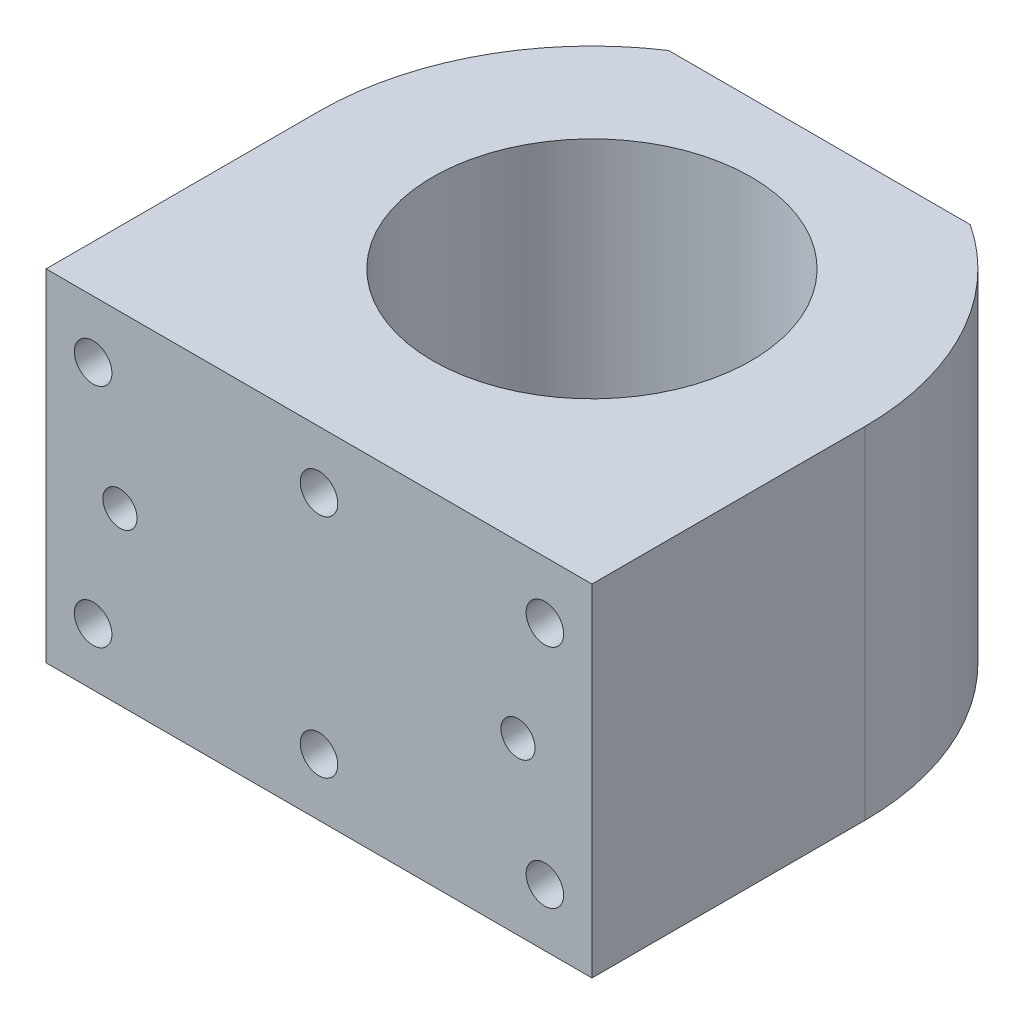
ISO-10303-21;
HEADER;
FILE_DESCRIPTION(('STEP AP214'),'2;1');
FILE_NAME('part.step','',(''),(''),'','','');
FILE_SCHEMA(('AUTOMOTIVE_DESIGN { 1 0 10303 214 1 1 1 1 }'));
ENDSEC;
DATA;
#1=APPLICATION_CONTEXT('core data for automotive mechanical design processes');
#2=APPLICATION_PROTOCOL_DEFINITION('international standard','automotive_design',2000,#1);
#3=PRODUCT_CONTEXT('',#1,'mechanical');
#4=PRODUCT('Part','Part','',(#3));
#5=PRODUCT_RELATED_PRODUCT_CATEGORY('part','',(#4));
#6=PRODUCT_DEFINITION_FORMATION('','',#4);
#7=PRODUCT_DEFINITION_CONTEXT('part definition',#1,'design');
#8=PRODUCT_DEFINITION('design','',#6,#7);
#9=PRODUCT_DEFINITION_SHAPE('','',#8);
#10=(LENGTH_UNIT() NAMED_UNIT(*) SI_UNIT(.MILLI.,.METRE.));
#11=(NAMED_UNIT(*) PLANE_ANGLE_UNIT() SI_UNIT($,.RADIAN.));
#12=(NAMED_UNIT(*) SI_UNIT($,.STERADIAN.) SOLID_ANGLE_UNIT());
#13=UNCERTAINTY_MEASURE_WITH_UNIT(LENGTH_MEASURE(1.E-05),#10,'distance_accuracy_value','');
#14=(GEOMETRIC_REPRESENTATION_CONTEXT(3) GLOBAL_UNCERTAINTY_ASSIGNED_CONTEXT((#13)) GLOBAL_UNIT_ASSIGNED_CONTEXT((#10,
#11,#12)) REPRESENTATION_CONTEXT('',''));
#15=CARTESIAN_POINT('',(0.,0.,0.));
#16=DIRECTION('',(0.,0.,1.));
#17=DIRECTION('',(1.,0.,0.));
#18=AXIS2_PLACEMENT_3D('',#15,#16,#17);
#19=CARTESIAN_POINT('',(0.,15.,0.));
#20=DIRECTION('',(0.,-1.,0.));
#21=DIRECTION('',(0.,0.,-1.));
#22=AXIS2_PLACEMENT_3D('',#19,#20,#21);
#23=CYLINDRICAL_SURFACE('',#22,24.);
#24=CARTESIAN_POINT('',(0.,-15.,0.));
#25=DIRECTION('',(0.,1.,0.));
#26=DIRECTION('',(0.,0.,1.));
#27=AXIS2_PLACEMENT_3D('',#24,#25,#26);
#28=CIRCLE('',#27,24.);
#29=CARTESIAN_POINT('',(24.,-15.,0.));
#30=VERTEX_POINT('',#29);
#31=CARTESIAN_POINT('',(13.2664991614216,-15.,-20.));
#32=VERTEX_POINT('',#31);
#33=EDGE_CURVE('E138',#30,#32,#28,.T.);
#34=ORIENTED_EDGE('',*,*,#33,.T.);
#35=DIRECTION('',(0.,-1.,0.));
#36=VECTOR('',#35,1.);
#37=CARTESIAN_POINT('',(13.2664991614216,15.,-20.));
#38=LINE('',#37,#36);
#39=CARTESIAN_POINT('',(13.2664991614216,15.,-20.));
#40=VERTEX_POINT('',#39);
#41=EDGE_CURVE('E11',#40,#32,#38,.T.);
#42=ORIENTED_EDGE('',*,*,#41,.F.);
#43=CARTESIAN_POINT('',(0.,15.,0.));
#44=DIRECTION('',(0.,1.,0.));
#45=DIRECTION('',(0.,0.,1.));
#46=AXIS2_PLACEMENT_3D('',#43,#44,#45);
#47=CIRCLE('',#46,24.);
#48=CARTESIAN_POINT('',(24.,15.,0.));
#49=VERTEX_POINT('',#48);
#50=EDGE_CURVE('E153',#49,#40,#47,.T.);
#51=ORIENTED_EDGE('',*,*,#50,.F.);
#52=DIRECTION('',(0.,-1.,0.));
#53=VECTOR('',#52,1.);
#54=CARTESIAN_POINT('',(24.,15.,0.));
#55=LINE('',#54,#53);
#56=EDGE_CURVE('E135',#49,#30,#55,.T.);
#57=ORIENTED_EDGE('',*,*,#56,.T.);
#58=EDGE_LOOP('',(#34,#42,#51,#57));
#59=FACE_BOUND('',#58,.T.);
#60=ADVANCED_FACE('F42',(#59),#23,.T.);
#61=CARTESIAN_POINT('',(13.2664991614216,15.,-20.));
#62=DIRECTION('',(0.,0.,1.));
#63=DIRECTION('',(1.,0.,0.));
#64=AXIS2_PLACEMENT_3D('',#61,#62,#63);
#65=PLANE('',#64);
#66=DIRECTION('',(-1.,0.,0.));
#67=VECTOR('',#66,1.);
#68=CARTESIAN_POINT('',(13.2664991614216,-15.,-20.));
#69=LINE('',#68,#67);
#70=CARTESIAN_POINT('',(-13.2664991614216,-15.,-20.));
#71=VERTEX_POINT('',#70);
#72=EDGE_CURVE('E136',#32,#71,#69,.T.);
#73=ORIENTED_EDGE('',*,*,#72,.T.);
#74=DIRECTION('',(0.,-1.,0.));
#75=VECTOR('',#74,1.);
#76=CARTESIAN_POINT('',(-13.2664991614216,15.,-20.));
#77=LINE('',#76,#75);
#78=CARTESIAN_POINT('',(-13.2664991614216,15.,-20.));
#79=VERTEX_POINT('',#78);
#80=EDGE_CURVE('E52',#79,#71,#77,.T.);
#81=ORIENTED_EDGE('',*,*,#80,.F.);
#82=DIRECTION('',(-1.,0.,0.));
#83=VECTOR('',#82,1.);
#84=CARTESIAN_POINT('',(13.2664991614216,15.,-20.));
#85=LINE('',#84,#83);
#86=EDGE_CURVE('E97',#40,#79,#85,.T.);
#87=ORIENTED_EDGE('',*,*,#86,.F.);
#88=ORIENTED_EDGE('',*,*,#41,.T.);
#89=EDGE_LOOP('',(#73,#81,#87,#88));
#90=FACE_BOUND('',#89,.T.);
#91=ADVANCED_FACE('F183',(#90),#65,.F.);
#92=CARTESIAN_POINT('',(0.,15.,0.));
#93=DIRECTION('',(0.,-1.,0.));
#94=DIRECTION('',(0.,0.,-1.));
#95=AXIS2_PLACEMENT_3D('',#92,#93,#94);
#96=CYLINDRICAL_SURFACE('',#95,24.);
#97=CARTESIAN_POINT('',(0.,-15.,0.));
#98=DIRECTION('',(0.,1.,0.));
#99=DIRECTION('',(0.,0.,1.));
#100=AXIS2_PLACEMENT_3D('',#97,#98,#99);
#101=CIRCLE('',#100,24.);
#102=CARTESIAN_POINT('',(-24.,-15.,0.));
#103=VERTEX_POINT('',#102);
#104=EDGE_CURVE('E145',#71,#103,#101,.T.);
#105=ORIENTED_EDGE('',*,*,#104,.T.);
#106=DIRECTION('',(0.,-1.,0.));
#107=VECTOR('',#106,1.);
#108=CARTESIAN_POINT('',(-24.,15.,0.));
#109=LINE('',#108,#107);
#110=CARTESIAN_POINT('',(-24.,15.,0.));
#111=VERTEX_POINT('',#110);
#112=EDGE_CURVE('E121',#111,#103,#109,.T.);
#113=ORIENTED_EDGE('',*,*,#112,.F.);
#114=CARTESIAN_POINT('',(0.,15.,0.));
#115=DIRECTION('',(0.,1.,0.));
#116=DIRECTION('',(0.,0.,1.));
#117=AXIS2_PLACEMENT_3D('',#114,#115,#116);
#118=CIRCLE('',#117,24.);
#119=EDGE_CURVE('E111',#79,#111,#118,.T.);
#120=ORIENTED_EDGE('',*,*,#119,.F.);
#121=ORIENTED_EDGE('',*,*,#80,.T.);
#122=EDGE_LOOP('',(#105,#113,#120,#121));
#123=FACE_BOUND('',#122,.T.);
#124=ADVANCED_FACE('F162',(#123),#96,.T.);
#125=CARTESIAN_POINT('',(-24.,15.,0.));
#126=DIRECTION('',(1.,0.,0.));
#127=DIRECTION('',(0.,0.,-1.));
#128=AXIS2_PLACEMENT_3D('',#125,#126,#127);
#129=PLANE('',#128);
#130=DIRECTION('',(0.,0.,1.));
#131=VECTOR('',#130,1.);
#132=CARTESIAN_POINT('',(-24.,-15.,0.));
#133=LINE('',#132,#131);
#134=CARTESIAN_POINT('',(-24.,-15.,24.));
#135=VERTEX_POINT('',#134);
#136=EDGE_CURVE('E122',#103,#135,#133,.T.);
#137=ORIENTED_EDGE('',*,*,#136,.T.);
#138=DIRECTION('',(0.,-1.,0.));
#139=VECTOR('',#138,1.);
#140=CARTESIAN_POINT('',(-24.,15.,24.));
#141=LINE('',#140,#139);
#142=CARTESIAN_POINT('',(-24.,15.,24.));
#143=VERTEX_POINT('',#142);
#144=EDGE_CURVE('E118',#143,#135,#141,.T.);
#145=ORIENTED_EDGE('',*,*,#144,.F.);
#146=DIRECTION('',(0.,0.,1.));
#147=VECTOR('',#146,1.);
#148=CARTESIAN_POINT('',(-24.,15.,0.));
#149=LINE('',#148,#147);
#150=EDGE_CURVE('E107',#111,#143,#149,.T.);
#151=ORIENTED_EDGE('',*,*,#150,.F.);
#152=ORIENTED_EDGE('',*,*,#112,.T.);
#153=EDGE_LOOP('',(#137,#145,#151,#152));
#154=FACE_BOUND('',#153,.T.);
#155=ADVANCED_FACE('F123',(#154),#129,.F.);
#156=CARTESIAN_POINT('',(24.,15.,24.));
#157=DIRECTION('',(0.,0.,-1.));
#158=DIRECTION('',(-1.,0.,0.));
#159=AXIS2_PLACEMENT_3D('',#156,#157,#158);
#160=PLANE('',#159);
#161=CARTESIAN_POINT('',(-17.5,0.,24.));
#162=DIRECTION('',(0.,0.,1.));
#163=DIRECTION('',(1.,0.,0.));
#164=AXIS2_PLACEMENT_3D('',#161,#162,#163);
#165=CIRCLE('',#164,1.5);
#166=CARTESIAN_POINT('',(-16.,0.,24.));
#167=VERTEX_POINT('',#166);
#168=EDGE_CURVE('E417',#167,#167,#165,.T.);
#169=ORIENTED_EDGE('',*,*,#168,.F.);
#170=EDGE_LOOP('',(#169));
#171=FACE_BOUND('',#170,.T.);
#172=CARTESIAN_POINT('',(17.5,0.,24.));
#173=DIRECTION('',(0.,0.,1.));
#174=DIRECTION('',(1.,0.,0.));
#175=AXIS2_PLACEMENT_3D('',#172,#173,#174);
#176=CIRCLE('',#175,1.5);
#177=CARTESIAN_POINT('',(19.,0.,24.));
#178=VERTEX_POINT('',#177);
#179=EDGE_CURVE('E430',#178,#178,#176,.T.);
#180=ORIENTED_EDGE('',*,*,#179,.F.);
#181=EDGE_LOOP('',(#180));
#182=FACE_BOUND('',#181,.T.);
#183=CARTESIAN_POINT('',(-19.86,9.95,24.));
#184=DIRECTION('',(0.,0.,1.));
#185=DIRECTION('',(1.,0.,0.));
#186=AXIS2_PLACEMENT_3D('',#183,#184,#185);
#187=CIRCLE('',#186,1.64999999999999);
#188=CARTESIAN_POINT('',(-18.21,9.95,24.));
#189=VERTEX_POINT('',#188);
#190=EDGE_CURVE('E434',#189,#189,#187,.T.);
#191=ORIENTED_EDGE('',*,*,#190,.F.);
#192=EDGE_LOOP('',(#191));
#193=FACE_BOUND('',#192,.T.);
#194=CARTESIAN_POINT('',(0.,9.95,24.));
#195=DIRECTION('',(0.,0.,1.));
#196=DIRECTION('',(1.,0.,0.));
#197=AXIS2_PLACEMENT_3D('',#194,#195,#196);
#198=CIRCLE('',#197,1.64999999999999);
#199=CARTESIAN_POINT('',(1.64999999999999,9.95,24.));
#200=VERTEX_POINT('',#199);
#201=EDGE_CURVE('E444',#200,#200,#198,.T.);
#202=ORIENTED_EDGE('',*,*,#201,.F.);
#203=EDGE_LOOP('',(#202));
#204=FACE_BOUND('',#203,.T.);
#205=CARTESIAN_POINT('',(19.86,9.95,24.));
#206=DIRECTION('',(0.,0.,1.));
#207=DIRECTION('',(1.,0.,0.));
#208=AXIS2_PLACEMENT_3D('',#205,#206,#207);
#209=CIRCLE('',#208,1.64999999999999);
#210=CARTESIAN_POINT('',(21.51,9.95,24.));
#211=VERTEX_POINT('',#210);
#212=EDGE_CURVE('E453',#211,#211,#209,.T.);
#213=ORIENTED_EDGE('',*,*,#212,.F.);
#214=EDGE_LOOP('',(#213));
#215=FACE_BOUND('',#214,.T.);
#216=CARTESIAN_POINT('',(19.86,-9.95,24.));
#217=DIRECTION('',(0.,0.,1.));
#218=DIRECTION('',(1.,0.,0.));
#219=AXIS2_PLACEMENT_3D('',#216,#217,#218);
#220=CIRCLE('',#219,1.64999999999999);
#221=CARTESIAN_POINT('',(21.51,-9.95,24.));
#222=VERTEX_POINT('',#221);
#223=EDGE_CURVE('E459',#222,#222,#220,.T.);
#224=ORIENTED_EDGE('',*,*,#223,.F.);
#225=EDGE_LOOP('',(#224));
#226=FACE_BOUND('',#225,.T.);
#227=CARTESIAN_POINT('',(0.,-9.95,24.));
#228=DIRECTION('',(0.,0.,1.));
#229=DIRECTION('',(1.,0.,0.));
#230=AXIS2_PLACEMENT_3D('',#227,#228,#229);
#231=CIRCLE('',#230,1.64999999999999);
#232=CARTESIAN_POINT('',(1.64999999999999,-9.95,24.));
#233=VERTEX_POINT('',#232);
#234=EDGE_CURVE('E469',#233,#233,#231,.T.);
#235=ORIENTED_EDGE('',*,*,#234,.F.);
#236=EDGE_LOOP('',(#235));
#237=FACE_BOUND('',#236,.T.);
#238=CARTESIAN_POINT('',(-19.86,-9.95,24.));
#239=DIRECTION('',(0.,0.,1.));
#240=DIRECTION('',(1.,0.,0.));
#241=AXIS2_PLACEMENT_3D('',#238,#239,#240);
#242=CIRCLE('',#241,1.64999999999999);
#243=CARTESIAN_POINT('',(-18.21,-9.95,24.));
#244=VERTEX_POINT('',#243);
#245=EDGE_CURVE('E474',#244,#244,#242,.T.);
#246=ORIENTED_EDGE('',*,*,#245,.F.);
#247=EDGE_LOOP('',(#246));
#248=FACE_BOUND('',#247,.T.);
#249=DIRECTION('',(1.,0.,0.));
#250=VECTOR('',#249,1.);
#251=CARTESIAN_POINT('',(24.,-15.,24.));
#252=LINE('',#251,#250);
#253=CARTESIAN_POINT('',(24.,-15.,24.));
#254=VERTEX_POINT('',#253);
#255=EDGE_CURVE('E81',#135,#254,#252,.T.);
#256=ORIENTED_EDGE('',*,*,#255,.T.);
#257=DIRECTION('',(0.,-1.,0.));
#258=VECTOR('',#257,1.);
#259=CARTESIAN_POINT('',(24.,15.,24.));
#260=LINE('',#259,#258);
#261=CARTESIAN_POINT('',(24.,15.,24.));
#262=VERTEX_POINT('',#261);
#263=EDGE_CURVE('E127',#262,#254,#260,.T.);
#264=ORIENTED_EDGE('',*,*,#263,.F.);
#265=DIRECTION('',(1.,0.,0.));
#266=VECTOR('',#265,1.);
#267=CARTESIAN_POINT('',(24.,15.,24.));
#268=LINE('',#267,#266);
#269=EDGE_CURVE('E115',#143,#262,#268,.T.);
#270=ORIENTED_EDGE('',*,*,#269,.F.);
#271=ORIENTED_EDGE('',*,*,#144,.T.);
#272=EDGE_LOOP('',(#256,#264,#270,#271));
#273=FACE_BOUND('',#272,.T.);
#274=ADVANCED_FACE('F126',(#171,#182,#193,#204,#215,#226,#237,#248,#273),#160,.F.);
#275=CARTESIAN_POINT('',(24.,15.,0.));
#276=DIRECTION('',(-1.,0.,0.));
#277=DIRECTION('',(0.,0.,1.));
#278=AXIS2_PLACEMENT_3D('',#275,#276,#277);
#279=PLANE('',#278);
#280=DIRECTION('',(0.,0.,-1.));
#281=VECTOR('',#280,1.);
#282=CARTESIAN_POINT('',(24.,-15.,0.));
#283=LINE('',#282,#281);
#284=EDGE_CURVE('E93',#254,#30,#283,.T.);
#285=ORIENTED_EDGE('',*,*,#284,.T.);
#286=ORIENTED_EDGE('',*,*,#56,.F.);
#287=DIRECTION('',(0.,0.,-1.));
#288=VECTOR('',#287,1.);
#289=CARTESIAN_POINT('',(24.,15.,0.));
#290=LINE('',#289,#288);
#291=EDGE_CURVE('E62',#262,#49,#290,.T.);
#292=ORIENTED_EDGE('',*,*,#291,.F.);
#293=ORIENTED_EDGE('',*,*,#263,.T.);
#294=EDGE_LOOP('',(#285,#286,#292,#293));
#295=FACE_BOUND('',#294,.T.);
#296=ADVANCED_FACE('F168',(#295),#279,.F.);
#297=CARTESIAN_POINT('',(0.,15.,0.));
#298=DIRECTION('',(0.,1.,0.));
#299=DIRECTION('',(0.,0.,1.));
#300=AXIS2_PLACEMENT_3D('',#297,#298,#299);
#301=PLANE('',#300);
#302=CARTESIAN_POINT('',(0.,15.,0.));
#303=DIRECTION('',(0.,-1.,0.));
#304=DIRECTION('',(0.,0.,-1.));
#305=AXIS2_PLACEMENT_3D('',#302,#303,#304);
#306=CIRCLE('',#305,14.);
#307=CARTESIAN_POINT('',(0.,15.,-14.));
#308=VERTEX_POINT('',#307);
#309=EDGE_CURVE('E408',#308,#308,#306,.T.);
#310=ORIENTED_EDGE('',*,*,#309,.T.);
#311=EDGE_LOOP('',(#310));
#312=FACE_BOUND('',#311,.T.);
#313=ORIENTED_EDGE('',*,*,#50,.T.);
#314=ORIENTED_EDGE('',*,*,#86,.T.);
#315=ORIENTED_EDGE('',*,*,#119,.T.);
#316=ORIENTED_EDGE('',*,*,#150,.T.);
#317=ORIENTED_EDGE('',*,*,#269,.T.);
#318=ORIENTED_EDGE('',*,*,#291,.T.);
#319=EDGE_LOOP('',(#313,#314,#315,#316,#317,#318));
#320=FACE_BOUND('',#319,.T.);
#321=ADVANCED_FACE('F109',(#312,#320),#301,.T.);
#322=CARTESIAN_POINT('',(0.,-15.,0.));
#323=DIRECTION('',(0.,1.,0.));
#324=DIRECTION('',(0.,0.,1.));
#325=AXIS2_PLACEMENT_3D('',#322,#323,#324);
#326=PLANE('',#325);
#327=CARTESIAN_POINT('',(0.,-15.,0.));
#328=DIRECTION('',(0.,-1.,0.));
#329=DIRECTION('',(0.,0.,-1.));
#330=AXIS2_PLACEMENT_3D('',#327,#328,#329);
#331=CIRCLE('',#330,14.);
#332=CARTESIAN_POINT('',(0.,-15.,-14.));
#333=VERTEX_POINT('',#332);
#334=EDGE_CURVE('E412',#333,#333,#331,.T.);
#335=ORIENTED_EDGE('',*,*,#334,.F.);
#336=EDGE_LOOP('',(#335));
#337=FACE_BOUND('',#336,.T.);
#338=ORIENTED_EDGE('',*,*,#33,.F.);
#339=ORIENTED_EDGE('',*,*,#284,.F.);
#340=ORIENTED_EDGE('',*,*,#255,.F.);
#341=ORIENTED_EDGE('',*,*,#136,.F.);
#342=ORIENTED_EDGE('',*,*,#104,.F.);
#343=ORIENTED_EDGE('',*,*,#72,.F.);
#344=EDGE_LOOP('',(#338,#339,#340,#341,#342,#343));
#345=FACE_BOUND('',#344,.T.);
#346=ADVANCED_FACE('F167',(#337,#345),#326,.F.);
#347=CARTESIAN_POINT('',(-19.86,-9.95,16.));
#348=DIRECTION('',(0.,0.,1.));
#349=DIRECTION('',(1.,0.,0.));
#350=AXIS2_PLACEMENT_3D('',#347,#348,#349);
#351=CONICAL_SURFACE('',#350,1.65,1.02974425867665);
#352=CARTESIAN_POINT('',(-19.86,-9.95,15.0085799786045));
#353=VERTEX_POINT('',#352);
#354=VERTEX_LOOP('',#353);
#355=FACE_BOUND('',#354,.T.);
#356=CARTESIAN_POINT('',(-19.86,-9.95,16.));
#357=DIRECTION('',(0.,0.,1.));
#358=DIRECTION('',(1.,0.,0.));
#359=AXIS2_PLACEMENT_3D('',#356,#357,#358);
#360=CIRCLE('',#359,1.65);
#361=CARTESIAN_POINT('',(-18.21,-9.95,16.));
#362=VERTEX_POINT('',#361);
#363=EDGE_CURVE('E143',#362,#362,#360,.T.);
#364=ORIENTED_EDGE('',*,*,#363,.T.);
#365=EDGE_LOOP('',(#364));
#366=FACE_BOUND('',#365,.T.);
#367=ADVANCED_FACE('F232',(#355,#366),#351,.F.);
#368=CARTESIAN_POINT('',(-19.86,-9.95,24.));
#369=DIRECTION('',(0.,0.,1.));
#370=DIRECTION('',(1.,0.,0.));
#371=AXIS2_PLACEMENT_3D('',#368,#369,#370);
#372=CYLINDRICAL_SURFACE('',#371,1.65);
#373=ORIENTED_EDGE('',*,*,#363,.F.);
#374=EDGE_LOOP('',(#373));
#375=FACE_BOUND('',#374,.T.);
#376=ORIENTED_EDGE('',*,*,#245,.T.);
#377=EDGE_LOOP('',(#376));
#378=FACE_BOUND('',#377,.T.);
#379=ADVANCED_FACE('F238',(#375,#378),#372,.F.);
#380=CARTESIAN_POINT('',(0.,-9.95,16.));
#381=DIRECTION('',(0.,0.,1.));
#382=DIRECTION('',(1.,0.,0.));
#383=AXIS2_PLACEMENT_3D('',#380,#381,#382);
#384=CONICAL_SURFACE('',#383,1.65,1.02974425867665);
#385=CARTESIAN_POINT('',(0.,-9.95,15.0085799786045));
#386=VERTEX_POINT('',#385);
#387=VERTEX_LOOP('',#386);
#388=FACE_BOUND('',#387,.T.);
#389=CARTESIAN_POINT('',(0.,-9.95,16.));
#390=DIRECTION('',(0.,0.,1.));
#391=DIRECTION('',(1.,0.,0.));
#392=AXIS2_PLACEMENT_3D('',#389,#390,#391);
#393=CIRCLE('',#392,1.65);
#394=CARTESIAN_POINT('',(1.65,-9.95,16.));
#395=VERTEX_POINT('',#394);
#396=EDGE_CURVE('E473',#395,#395,#393,.T.);
#397=ORIENTED_EDGE('',*,*,#396,.T.);
#398=EDGE_LOOP('',(#397));
#399=FACE_BOUND('',#398,.T.);
#400=ADVANCED_FACE('F250',(#388,#399),#384,.F.);
#401=CARTESIAN_POINT('',(0.,-9.95,24.));
#402=DIRECTION('',(0.,0.,1.));
#403=DIRECTION('',(1.,0.,0.));
#404=AXIS2_PLACEMENT_3D('',#401,#402,#403);
#405=CYLINDRICAL_SURFACE('',#404,1.64999999999999);
#406=ORIENTED_EDGE('',*,*,#396,.F.);
#407=EDGE_LOOP('',(#406));
#408=FACE_BOUND('',#407,.T.);
#409=ORIENTED_EDGE('',*,*,#234,.T.);
#410=EDGE_LOOP('',(#409));
#411=FACE_BOUND('',#410,.T.);
#412=ADVANCED_FACE('F256',(#408,#411),#405,.F.);
#413=CARTESIAN_POINT('',(19.86,-9.95,16.));
#414=DIRECTION('',(0.,0.,1.));
#415=DIRECTION('',(1.,0.,0.));
#416=AXIS2_PLACEMENT_3D('',#413,#414,#415);
#417=CONICAL_SURFACE('',#416,1.65,1.02974425867665);
#418=CARTESIAN_POINT('',(19.86,-9.95,15.0085799786045));
#419=VERTEX_POINT('',#418);
#420=VERTEX_LOOP('',#419);
#421=FACE_BOUND('',#420,.T.);
#422=CARTESIAN_POINT('',(19.86,-9.95,16.));
#423=DIRECTION('',(0.,0.,1.));
#424=DIRECTION('',(1.,0.,0.));
#425=AXIS2_PLACEMENT_3D('',#422,#423,#424);
#426=CIRCLE('',#425,1.65);
#427=CARTESIAN_POINT('',(21.51,-9.95,16.));
#428=VERTEX_POINT('',#427);
#429=EDGE_CURVE('E464',#428,#428,#426,.T.);
#430=ORIENTED_EDGE('',*,*,#429,.T.);
#431=EDGE_LOOP('',(#430));
#432=FACE_BOUND('',#431,.T.);
#433=ADVANCED_FACE('F270',(#421,#432),#417,.F.);
#434=CARTESIAN_POINT('',(19.86,-9.95,24.));
#435=DIRECTION('',(0.,0.,1.));
#436=DIRECTION('',(1.,0.,0.));
#437=AXIS2_PLACEMENT_3D('',#434,#435,#436);
#438=CYLINDRICAL_SURFACE('',#437,1.65);
#439=ORIENTED_EDGE('',*,*,#429,.F.);
#440=EDGE_LOOP('',(#439));
#441=FACE_BOUND('',#440,.T.);
#442=ORIENTED_EDGE('',*,*,#223,.T.);
#443=EDGE_LOOP('',(#442));
#444=FACE_BOUND('',#443,.T.);
#445=ADVANCED_FACE('F277',(#441,#444),#438,.F.);
#446=CARTESIAN_POINT('',(19.86,9.95,16.));
#447=DIRECTION('',(0.,0.,1.));
#448=DIRECTION('',(1.,0.,0.));
#449=AXIS2_PLACEMENT_3D('',#446,#447,#448);
#450=CONICAL_SURFACE('',#449,1.65,1.02974425867665);
#451=CARTESIAN_POINT('',(19.86,9.95,15.0085799786045));
#452=VERTEX_POINT('',#451);
#453=VERTEX_LOOP('',#452);
#454=FACE_BOUND('',#453,.T.);
#455=CARTESIAN_POINT('',(19.86,9.95,16.));
#456=DIRECTION('',(0.,0.,1.));
#457=DIRECTION('',(1.,0.,0.));
#458=AXIS2_PLACEMENT_3D('',#455,#456,#457);
#459=CIRCLE('',#458,1.65);
#460=CARTESIAN_POINT('',(21.51,9.95,16.));
#461=VERTEX_POINT('',#460);
#462=EDGE_CURVE('E451',#461,#461,#459,.T.);
#463=ORIENTED_EDGE('',*,*,#462,.T.);
#464=EDGE_LOOP('',(#463));
#465=FACE_BOUND('',#464,.T.);
#466=ADVANCED_FACE('F283',(#454,#465),#450,.F.);
#467=CARTESIAN_POINT('',(19.86,9.95,24.));
#468=DIRECTION('',(0.,0.,1.));
#469=DIRECTION('',(1.,0.,0.));
#470=AXIS2_PLACEMENT_3D('',#467,#468,#469);
#471=CYLINDRICAL_SURFACE('',#470,1.65);
#472=ORIENTED_EDGE('',*,*,#462,.F.);
#473=EDGE_LOOP('',(#472));
#474=FACE_BOUND('',#473,.T.);
#475=ORIENTED_EDGE('',*,*,#212,.T.);
#476=EDGE_LOOP('',(#475));
#477=FACE_BOUND('',#476,.T.);
#478=ADVANCED_FACE('F294',(#474,#477),#471,.F.);
#479=CARTESIAN_POINT('',(0.,9.95,16.));
#480=DIRECTION('',(0.,0.,1.));
#481=DIRECTION('',(1.,0.,0.));
#482=AXIS2_PLACEMENT_3D('',#479,#480,#481);
#483=CONICAL_SURFACE('',#482,1.65,1.02974425867665);
#484=CARTESIAN_POINT('',(0.,9.95,15.0085799786045));
#485=VERTEX_POINT('',#484);
#486=VERTEX_LOOP('',#485);
#487=FACE_BOUND('',#486,.T.);
#488=CARTESIAN_POINT('',(0.,9.95,16.));
#489=DIRECTION('',(0.,0.,1.));
#490=DIRECTION('',(1.,0.,0.));
#491=AXIS2_PLACEMENT_3D('',#488,#489,#490);
#492=CIRCLE('',#491,1.65);
#493=CARTESIAN_POINT('',(1.65,9.95,16.));
#494=VERTEX_POINT('',#493);
#495=EDGE_CURVE('E450',#494,#494,#492,.T.);
#496=ORIENTED_EDGE('',*,*,#495,.T.);
#497=EDGE_LOOP('',(#496));
#498=FACE_BOUND('',#497,.T.);
#499=ADVANCED_FACE('F302',(#487,#498),#483,.F.);
#500=CARTESIAN_POINT('',(0.,9.95,24.));
#501=DIRECTION('',(0.,0.,1.));
#502=DIRECTION('',(1.,0.,0.));
#503=AXIS2_PLACEMENT_3D('',#500,#501,#502);
#504=CYLINDRICAL_SURFACE('',#503,1.64999999999999);
#505=ORIENTED_EDGE('',*,*,#495,.F.);
#506=EDGE_LOOP('',(#505));
#507=FACE_BOUND('',#506,.T.);
#508=ORIENTED_EDGE('',*,*,#201,.T.);
#509=EDGE_LOOP('',(#508));
#510=FACE_BOUND('',#509,.T.);
#511=ADVANCED_FACE('F315',(#507,#510),#504,.F.);
#512=CARTESIAN_POINT('',(-19.86,9.95,16.));
#513=DIRECTION('',(0.,0.,1.));
#514=DIRECTION('',(1.,0.,0.));
#515=AXIS2_PLACEMENT_3D('',#512,#513,#514);
#516=CONICAL_SURFACE('',#515,1.65,1.02974425867665);
#517=CARTESIAN_POINT('',(-19.86,9.95,15.0085799786045));
#518=VERTEX_POINT('',#517);
#519=VERTEX_LOOP('',#518);
#520=FACE_BOUND('',#519,.T.);
#521=CARTESIAN_POINT('',(-19.86,9.95,16.));
#522=DIRECTION('',(0.,0.,1.));
#523=DIRECTION('',(1.,0.,0.));
#524=AXIS2_PLACEMENT_3D('',#521,#522,#523);
#525=CIRCLE('',#524,1.65);
#526=CARTESIAN_POINT('',(-18.21,9.95,16.));
#527=VERTEX_POINT('',#526);
#528=EDGE_CURVE('E438',#527,#527,#525,.T.);
#529=ORIENTED_EDGE('',*,*,#528,.T.);
#530=EDGE_LOOP('',(#529));
#531=FACE_BOUND('',#530,.T.);
#532=ADVANCED_FACE('F321',(#520,#531),#516,.F.);
#533=CARTESIAN_POINT('',(-19.86,9.95,24.));
#534=DIRECTION('',(0.,0.,1.));
#535=DIRECTION('',(1.,0.,0.));
#536=AXIS2_PLACEMENT_3D('',#533,#534,#535);
#537=CYLINDRICAL_SURFACE('',#536,1.65);
#538=ORIENTED_EDGE('',*,*,#528,.F.);
#539=EDGE_LOOP('',(#538));
#540=FACE_BOUND('',#539,.T.);
#541=ORIENTED_EDGE('',*,*,#190,.T.);
#542=EDGE_LOOP('',(#541));
#543=FACE_BOUND('',#542,.T.);
#544=ADVANCED_FACE('F329',(#540,#543),#537,.F.);
#545=CARTESIAN_POINT('',(17.5,0.,19.15));
#546=DIRECTION('',(0.,0.,1.));
#547=DIRECTION('',(1.,0.,0.));
#548=AXIS2_PLACEMENT_3D('',#545,#546,#547);
#549=CONICAL_SURFACE('',#548,1.5,1.02974425867665);
#550=CARTESIAN_POINT('',(17.5,0.,18.2487090714587));
#551=VERTEX_POINT('',#550);
#552=VERTEX_LOOP('',#551);
#553=FACE_BOUND('',#552,.T.);
#554=CARTESIAN_POINT('',(17.5,0.,19.15));
#555=DIRECTION('',(0.,0.,1.));
#556=DIRECTION('',(1.,0.,0.));
#557=AXIS2_PLACEMENT_3D('',#554,#555,#556);
#558=CIRCLE('',#557,1.5);
#559=CARTESIAN_POINT('',(19.,0.,19.15));
#560=VERTEX_POINT('',#559);
#561=EDGE_CURVE('E431',#560,#560,#558,.T.);
#562=ORIENTED_EDGE('',*,*,#561,.T.);
#563=EDGE_LOOP('',(#562));
#564=FACE_BOUND('',#563,.T.);
#565=ADVANCED_FACE('F336',(#553,#564),#549,.F.);
#566=CARTESIAN_POINT('',(17.5,0.,24.));
#567=DIRECTION('',(0.,0.,1.));
#568=DIRECTION('',(1.,0.,0.));
#569=AXIS2_PLACEMENT_3D('',#566,#567,#568);
#570=CYLINDRICAL_SURFACE('',#569,1.5);
#571=ORIENTED_EDGE('',*,*,#561,.F.);
#572=EDGE_LOOP('',(#571));
#573=FACE_BOUND('',#572,.T.);
#574=ORIENTED_EDGE('',*,*,#179,.T.);
#575=EDGE_LOOP('',(#574));
#576=FACE_BOUND('',#575,.T.);
#577=ADVANCED_FACE('F346',(#573,#576),#570,.F.);
#578=CARTESIAN_POINT('',(-17.5,0.,19.15));
#579=DIRECTION('',(0.,0.,1.));
#580=DIRECTION('',(1.,0.,0.));
#581=AXIS2_PLACEMENT_3D('',#578,#579,#580);
#582=CONICAL_SURFACE('',#581,1.5,1.02974425867665);
#583=CARTESIAN_POINT('',(-17.5,0.,18.2487090714587));
#584=VERTEX_POINT('',#583);
#585=VERTEX_LOOP('',#584);
#586=FACE_BOUND('',#585,.T.);
#587=CARTESIAN_POINT('',(-17.5,0.,19.15));
#588=DIRECTION('',(0.,0.,1.));
#589=DIRECTION('',(1.,0.,0.));
#590=AXIS2_PLACEMENT_3D('',#587,#588,#589);
#591=CIRCLE('',#590,1.5);
#592=CARTESIAN_POINT('',(-16.,0.,19.15));
#593=VERTEX_POINT('',#592);
#594=EDGE_CURVE('E421',#593,#593,#591,.T.);
#595=ORIENTED_EDGE('',*,*,#594,.T.);
#596=EDGE_LOOP('',(#595));
#597=FACE_BOUND('',#596,.T.);
#598=ADVANCED_FACE('F359',(#586,#597),#582,.F.);
#599=CARTESIAN_POINT('',(-17.5,0.,24.));
#600=DIRECTION('',(0.,0.,1.));
#601=DIRECTION('',(1.,0.,0.));
#602=AXIS2_PLACEMENT_3D('',#599,#600,#601);
#603=CYLINDRICAL_SURFACE('',#602,1.5);
#604=ORIENTED_EDGE('',*,*,#594,.F.);
#605=EDGE_LOOP('',(#604));
#606=FACE_BOUND('',#605,.T.);
#607=ORIENTED_EDGE('',*,*,#168,.T.);
#608=EDGE_LOOP('',(#607));
#609=FACE_BOUND('',#608,.T.);
#610=ADVANCED_FACE('F368',(#606,#609),#603,.F.);
#611=CARTESIAN_POINT('',(0.,15.,0.));
#612=DIRECTION('',(0.,-1.,0.));
#613=DIRECTION('',(0.,0.,-1.));
#614=AXIS2_PLACEMENT_3D('',#611,#612,#613);
#615=CYLINDRICAL_SURFACE('',#614,14.);
#616=ORIENTED_EDGE('',*,*,#309,.F.);
#617=EDGE_LOOP('',(#616));
#618=FACE_BOUND('',#617,.T.);
#619=ORIENTED_EDGE('',*,*,#334,.T.);
#620=EDGE_LOOP('',(#619));
#621=FACE_BOUND('',#620,.T.);
#622=ADVANCED_FACE('F374',(#618,#621),#615,.F.);
#623=CLOSED_SHELL('',(#60,#91,#124,#155,#274,#296,#321,#346,#367,#379,#400,#412,#433,#445,#466,
#478,#499,#511,#532,#544,#565,#577,#598,#610,#622));
#624=MANIFOLD_SOLID_BREP('B2',#623);
#625=ADVANCED_BREP_SHAPE_REPRESENTATION('',(#18,#624),#14);
#626=SHAPE_DEFINITION_REPRESENTATION(#9,#625);
ENDSEC;
END-ISO-10303-21;
